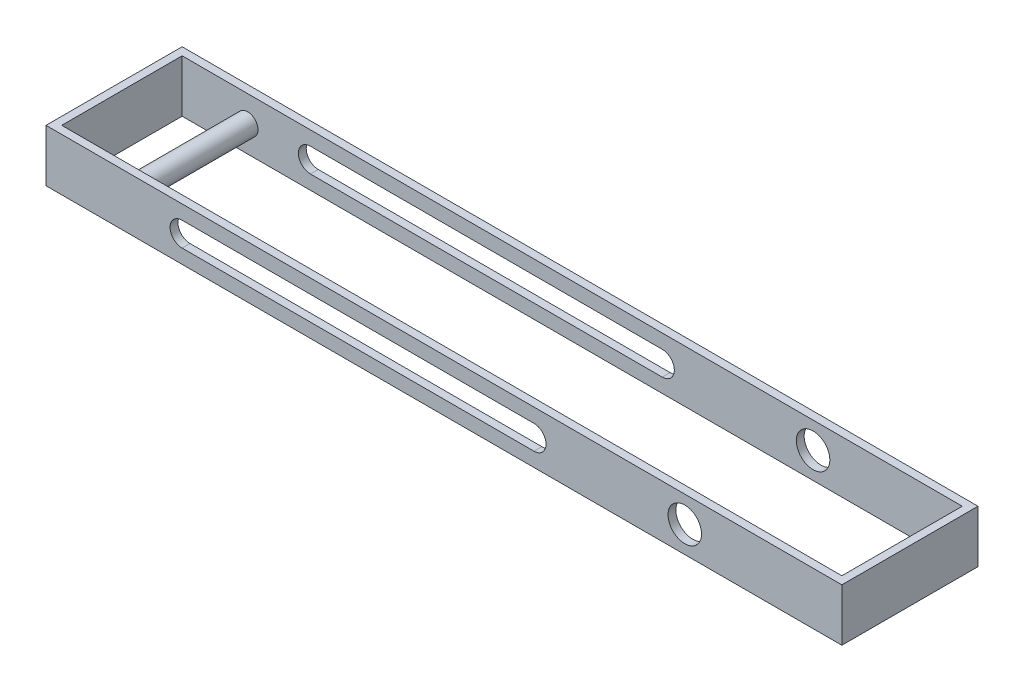
ISO-10303-21;
HEADER;
FILE_DESCRIPTION(('STEP AP214'),'2;1');
FILE_NAME('part.step','',(''),(''),'','','');
FILE_SCHEMA(('AUTOMOTIVE_DESIGN { 1 0 10303 214 1 1 1 1 }'));
ENDSEC;
DATA;
#1=APPLICATION_CONTEXT('core data for automotive mechanical design processes');
#2=APPLICATION_PROTOCOL_DEFINITION('international standard','automotive_design',2000,#1);
#3=PRODUCT_CONTEXT('',#1,'mechanical');
#4=PRODUCT('Part','Part','',(#3));
#5=PRODUCT_RELATED_PRODUCT_CATEGORY('part','',(#4));
#6=PRODUCT_DEFINITION_FORMATION('','',#4);
#7=PRODUCT_DEFINITION_CONTEXT('part definition',#1,'design');
#8=PRODUCT_DEFINITION('design','',#6,#7);
#9=PRODUCT_DEFINITION_SHAPE('','',#8);
#10=(LENGTH_UNIT() NAMED_UNIT(*) SI_UNIT(.MILLI.,.METRE.));
#11=(NAMED_UNIT(*) PLANE_ANGLE_UNIT() SI_UNIT($,.RADIAN.));
#12=(NAMED_UNIT(*) SI_UNIT($,.STERADIAN.) SOLID_ANGLE_UNIT());
#13=UNCERTAINTY_MEASURE_WITH_UNIT(LENGTH_MEASURE(1.E-05),#10,'distance_accuracy_value','');
#14=(GEOMETRIC_REPRESENTATION_CONTEXT(3) GLOBAL_UNCERTAINTY_ASSIGNED_CONTEXT((#13)) GLOBAL_UNIT_ASSIGNED_CONTEXT((#10,
#11,#12)) REPRESENTATION_CONTEXT('',''));
#15=CARTESIAN_POINT('',(0.,0.,0.));
#16=DIRECTION('',(0.,0.,1.));
#17=DIRECTION('',(1.,0.,0.));
#18=AXIS2_PLACEMENT_3D('',#15,#16,#17);
#19=CARTESIAN_POINT('',(0.,2.5,0.));
#20=DIRECTION('',(0.,-1.,0.));
#21=DIRECTION('',(0.,0.,-1.));
#22=AXIS2_PLACEMENT_3D('',#19,#20,#21);
#23=PLANE('',#22);
#24=DIRECTION('',(0.,0.,1.));
#25=VECTOR('',#24,1.);
#26=CARTESIAN_POINT('',(-38.,2.5,-6.5));
#27=LINE('',#26,#25);
#28=CARTESIAN_POINT('',(-38.,2.5,-6.5));
#29=VERTEX_POINT('',#28);
#30=CARTESIAN_POINT('',(-38.,2.5,6.5));
#31=VERTEX_POINT('',#30);
#32=EDGE_CURVE('E290',#29,#31,#27,.T.);
#33=ORIENTED_EDGE('',*,*,#32,.T.);
#34=DIRECTION('',(1.,0.,0.));
#35=VECTOR('',#34,1.);
#36=CARTESIAN_POINT('',(38.,2.5,6.49999999999999));
#37=LINE('',#36,#35);
#38=CARTESIAN_POINT('',(38.,2.5,6.49999999999999));
#39=VERTEX_POINT('',#38);
#40=EDGE_CURVE('E294',#31,#39,#37,.T.);
#41=ORIENTED_EDGE('',*,*,#40,.T.);
#42=DIRECTION('',(0.,0.,-1.));
#43=VECTOR('',#42,1.);
#44=CARTESIAN_POINT('',(38.,2.5,-6.50000000000001));
#45=LINE('',#44,#43);
#46=CARTESIAN_POINT('',(38.,2.5,-6.50000000000001));
#47=VERTEX_POINT('',#46);
#48=EDGE_CURVE('E298',#39,#47,#45,.T.);
#49=ORIENTED_EDGE('',*,*,#48,.T.);
#50=DIRECTION('',(-1.,0.,0.));
#51=VECTOR('',#50,1.);
#52=CARTESIAN_POINT('',(38.,2.5,-6.50000000000001));
#53=LINE('',#52,#51);
#54=EDGE_CURVE('E301',#47,#29,#53,.T.);
#55=ORIENTED_EDGE('',*,*,#54,.T.);
#56=EDGE_LOOP('',(#33,#41,#49,#55));
#57=FACE_BOUND('',#56,.T.);
#58=DIRECTION('',(0.,0.,1.));
#59=VECTOR('',#58,1.);
#60=CARTESIAN_POINT('',(-37.25,2.5,-5.74999999999999));
#61=LINE('',#60,#59);
#62=CARTESIAN_POINT('',(-37.25,2.5,-5.74999999999999));
#63=VERTEX_POINT('',#62);
#64=CARTESIAN_POINT('',(-37.25,2.5,5.75));
#65=VERTEX_POINT('',#64);
#66=EDGE_CURVE('E247',#63,#65,#61,.T.);
#67=ORIENTED_EDGE('',*,*,#66,.F.);
#68=DIRECTION('',(-1.,0.,0.));
#69=VECTOR('',#68,1.);
#70=CARTESIAN_POINT('',(37.25,2.5,-5.75));
#71=LINE('',#70,#69);
#72=CARTESIAN_POINT('',(37.25,2.5,-5.75));
#73=VERTEX_POINT('',#72);
#74=EDGE_CURVE('E258',#73,#63,#71,.T.);
#75=ORIENTED_EDGE('',*,*,#74,.F.);
#76=DIRECTION('',(0.,0.,-1.));
#77=VECTOR('',#76,1.);
#78=CARTESIAN_POINT('',(37.25,2.5,-5.75));
#79=LINE('',#78,#77);
#80=CARTESIAN_POINT('',(37.25,2.5,5.75));
#81=VERTEX_POINT('',#80);
#82=EDGE_CURVE('E254',#81,#73,#79,.T.);
#83=ORIENTED_EDGE('',*,*,#82,.F.);
#84=DIRECTION('',(1.,0.,0.));
#85=VECTOR('',#84,1.);
#86=CARTESIAN_POINT('',(37.25,2.5,5.75));
#87=LINE('',#86,#85);
#88=EDGE_CURVE('E250',#65,#81,#87,.T.);
#89=ORIENTED_EDGE('',*,*,#88,.F.);
#90=EDGE_LOOP('',(#67,#75,#83,#89));
#91=FACE_BOUND('',#90,.T.);
#92=ADVANCED_FACE('F51',(#57,#91),#23,.F.);
#93=CARTESIAN_POINT('',(0.,-2.5,0.));
#94=DIRECTION('',(0.,-1.,0.));
#95=DIRECTION('',(0.,0.,-1.));
#96=AXIS2_PLACEMENT_3D('',#93,#94,#95);
#97=PLANE('',#96);
#98=DIRECTION('',(0.,0.,1.));
#99=VECTOR('',#98,1.);
#100=CARTESIAN_POINT('',(-38.,-2.5,-6.5));
#101=LINE('',#100,#99);
#102=CARTESIAN_POINT('',(-38.,-2.5,-6.5));
#103=VERTEX_POINT('',#102);
#104=CARTESIAN_POINT('',(-38.,-2.5,6.5));
#105=VERTEX_POINT('',#104);
#106=EDGE_CURVE('E289',#103,#105,#101,.T.);
#107=ORIENTED_EDGE('',*,*,#106,.F.);
#108=DIRECTION('',(-1.,0.,0.));
#109=VECTOR('',#108,1.);
#110=CARTESIAN_POINT('',(38.,-2.5,-6.50000000000001));
#111=LINE('',#110,#109);
#112=CARTESIAN_POINT('',(38.,-2.5,-6.50000000000001));
#113=VERTEX_POINT('',#112);
#114=EDGE_CURVE('E295',#113,#103,#111,.T.);
#115=ORIENTED_EDGE('',*,*,#114,.F.);
#116=DIRECTION('',(0.,0.,-1.));
#117=VECTOR('',#116,1.);
#118=CARTESIAN_POINT('',(38.,-2.5,-6.50000000000001));
#119=LINE('',#118,#117);
#120=CARTESIAN_POINT('',(38.,-2.5,6.49999999999999));
#121=VERTEX_POINT('',#120);
#122=EDGE_CURVE('E311',#121,#113,#119,.T.);
#123=ORIENTED_EDGE('',*,*,#122,.F.);
#124=DIRECTION('',(1.,0.,0.));
#125=VECTOR('',#124,1.);
#126=CARTESIAN_POINT('',(38.,-2.5,6.49999999999999));
#127=LINE('',#126,#125);
#128=EDGE_CURVE('E308',#105,#121,#127,.T.);
#129=ORIENTED_EDGE('',*,*,#128,.F.);
#130=EDGE_LOOP('',(#107,#115,#123,#129));
#131=FACE_BOUND('',#130,.T.);
#132=DIRECTION('',(-1.,0.,0.));
#133=VECTOR('',#132,1.);
#134=CARTESIAN_POINT('',(37.25,-2.5,-5.75));
#135=LINE('',#134,#133);
#136=CARTESIAN_POINT('',(37.25,-2.5,-5.75));
#137=VERTEX_POINT('',#136);
#138=CARTESIAN_POINT('',(-37.25,-2.5,-5.74999999999999));
#139=VERTEX_POINT('',#138);
#140=EDGE_CURVE('E251',#137,#139,#135,.T.);
#141=ORIENTED_EDGE('',*,*,#140,.T.);
#142=DIRECTION('',(0.,0.,1.));
#143=VECTOR('',#142,1.);
#144=CARTESIAN_POINT('',(-37.25,-2.5,-5.74999999999999));
#145=LINE('',#144,#143);
#146=CARTESIAN_POINT('',(-37.25,-2.5,5.75));
#147=VERTEX_POINT('',#146);
#148=EDGE_CURVE('E246',#139,#147,#145,.T.);
#149=ORIENTED_EDGE('',*,*,#148,.T.);
#150=DIRECTION('',(1.,0.,0.));
#151=VECTOR('',#150,1.);
#152=CARTESIAN_POINT('',(37.25,-2.5,5.75));
#153=LINE('',#152,#151);
#154=CARTESIAN_POINT('',(37.25,-2.5,5.75));
#155=VERTEX_POINT('',#154);
#156=EDGE_CURVE('E265',#147,#155,#153,.T.);
#157=ORIENTED_EDGE('',*,*,#156,.T.);
#158=DIRECTION('',(0.,0.,-1.));
#159=VECTOR('',#158,1.);
#160=CARTESIAN_POINT('',(37.25,-2.5,-5.75));
#161=LINE('',#160,#159);
#162=EDGE_CURVE('E269',#155,#137,#161,.T.);
#163=ORIENTED_EDGE('',*,*,#162,.T.);
#164=EDGE_LOOP('',(#141,#149,#157,#163));
#165=FACE_BOUND('',#164,.T.);
#166=ADVANCED_FACE('F360',(#131,#165),#97,.T.);
#167=CARTESIAN_POINT('',(-38.,2.5,-6.5));
#168=DIRECTION('',(1.,0.,0.));
#169=DIRECTION('',(0.,0.,-1.));
#170=AXIS2_PLACEMENT_3D('',#167,#168,#169);
#171=PLANE('',#170);
#172=ORIENTED_EDGE('',*,*,#106,.T.);
#173=DIRECTION('',(0.,-1.,0.));
#174=VECTOR('',#173,1.);
#175=CARTESIAN_POINT('',(-38.,2.5,6.5));
#176=LINE('',#175,#174);
#177=EDGE_CURVE('E327',#31,#105,#176,.T.);
#178=ORIENTED_EDGE('',*,*,#177,.F.);
#179=ORIENTED_EDGE('',*,*,#32,.F.);
#180=DIRECTION('',(0.,-1.,0.));
#181=VECTOR('',#180,1.);
#182=CARTESIAN_POINT('',(-38.,2.5,-6.5));
#183=LINE('',#182,#181);
#184=EDGE_CURVE('E304',#29,#103,#183,.T.);
#185=ORIENTED_EDGE('',*,*,#184,.T.);
#186=EDGE_LOOP('',(#172,#178,#179,#185));
#187=FACE_BOUND('',#186,.T.);
#188=ADVANCED_FACE('F53',(#187),#171,.F.);
#189=CARTESIAN_POINT('',(38.,2.5,6.49999999999999));
#190=DIRECTION('',(0.,0.,-1.));
#191=DIRECTION('',(-1.,0.,0.));
#192=AXIS2_PLACEMENT_3D('',#189,#190,#191);
#193=PLANE('',#192);
#194=CARTESIAN_POINT('',(23.,0.,6.5));
#195=DIRECTION('',(0.,0.,1.));
#196=DIRECTION('',(1.,0.,0.));
#197=AXIS2_PLACEMENT_3D('',#194,#195,#196);
#198=CIRCLE('',#197,1.6);
#199=CARTESIAN_POINT('',(24.6,0.,6.5));
#200=VERTEX_POINT('',#199);
#201=EDGE_CURVE('E200',#200,#200,#198,.T.);
#202=ORIENTED_EDGE('',*,*,#201,.F.);
#203=EDGE_LOOP('',(#202));
#204=FACE_BOUND('',#203,.T.);
#205=DIRECTION('',(1.,0.,0.));
#206=VECTOR('',#205,1.);
#207=CARTESIAN_POINT('',(-25.,-1.15,6.5));
#208=LINE('',#207,#206);
#209=CARTESIAN_POINT('',(-25.,-1.15,6.5));
#210=VERTEX_POINT('',#209);
#211=CARTESIAN_POINT('',(8.6,-1.15,6.5));
#212=VERTEX_POINT('',#211);
#213=EDGE_CURVE('E209',#210,#212,#208,.T.);
#214=ORIENTED_EDGE('',*,*,#213,.F.);
#215=CARTESIAN_POINT('',(-25.,0.,6.5));
#216=DIRECTION('',(0.,0.,1.));
#217=DIRECTION('',(1.,0.,0.));
#218=AXIS2_PLACEMENT_3D('',#215,#216,#217);
#219=CIRCLE('',#218,1.15);
#220=CARTESIAN_POINT('',(-25.,1.15,6.5));
#221=VERTEX_POINT('',#220);
#222=EDGE_CURVE('E68',#221,#210,#219,.T.);
#223=ORIENTED_EDGE('',*,*,#222,.F.);
#224=DIRECTION('',(-1.,0.,0.));
#225=VECTOR('',#224,1.);
#226=CARTESIAN_POINT('',(-25.,1.15,6.5));
#227=LINE('',#226,#225);
#228=CARTESIAN_POINT('',(8.6,1.15,6.5));
#229=VERTEX_POINT('',#228);
#230=EDGE_CURVE('E193',#229,#221,#227,.T.);
#231=ORIENTED_EDGE('',*,*,#230,.F.);
#232=CARTESIAN_POINT('',(8.6,0.,6.5));
#233=DIRECTION('',(0.,0.,1.));
#234=DIRECTION('',(1.,0.,0.));
#235=AXIS2_PLACEMENT_3D('',#232,#233,#234);
#236=CIRCLE('',#235,1.15);
#237=EDGE_CURVE('E197',#212,#229,#236,.T.);
#238=ORIENTED_EDGE('',*,*,#237,.F.);
#239=EDGE_LOOP('',(#214,#223,#231,#238));
#240=FACE_BOUND('',#239,.T.);
#241=ORIENTED_EDGE('',*,*,#128,.T.);
#242=DIRECTION('',(0.,-1.,0.));
#243=VECTOR('',#242,1.);
#244=CARTESIAN_POINT('',(38.,2.5,6.49999999999999));
#245=LINE('',#244,#243);
#246=EDGE_CURVE('E323',#39,#121,#245,.T.);
#247=ORIENTED_EDGE('',*,*,#246,.F.);
#248=ORIENTED_EDGE('',*,*,#40,.F.);
#249=ORIENTED_EDGE('',*,*,#177,.T.);
#250=EDGE_LOOP('',(#241,#247,#248,#249));
#251=FACE_BOUND('',#250,.T.);
#252=ADVANCED_FACE('F378',(#204,#240,#251),#193,.F.);
#253=CARTESIAN_POINT('',(38.,2.5,-6.50000000000001));
#254=DIRECTION('',(-1.,0.,0.));
#255=DIRECTION('',(0.,0.,1.));
#256=AXIS2_PLACEMENT_3D('',#253,#254,#255);
#257=PLANE('',#256);
#258=ORIENTED_EDGE('',*,*,#122,.T.);
#259=DIRECTION('',(0.,-1.,0.));
#260=VECTOR('',#259,1.);
#261=CARTESIAN_POINT('',(38.,2.5,-6.50000000000001));
#262=LINE('',#261,#260);
#263=EDGE_CURVE('E319',#47,#113,#262,.T.);
#264=ORIENTED_EDGE('',*,*,#263,.F.);
#265=ORIENTED_EDGE('',*,*,#48,.F.);
#266=ORIENTED_EDGE('',*,*,#246,.T.);
#267=EDGE_LOOP('',(#258,#264,#265,#266));
#268=FACE_BOUND('',#267,.T.);
#269=ADVANCED_FACE('F375',(#268),#257,.F.);
#270=CARTESIAN_POINT('',(38.,2.5,-6.50000000000001));
#271=DIRECTION('',(0.,0.,1.));
#272=DIRECTION('',(1.,0.,0.));
#273=AXIS2_PLACEMENT_3D('',#270,#271,#272);
#274=PLANE('',#273);
#275=CARTESIAN_POINT('',(23.,0.,-6.50000000000001));
#276=DIRECTION('',(0.,0.,1.));
#277=DIRECTION('',(1.,0.,0.));
#278=AXIS2_PLACEMENT_3D('',#275,#276,#277);
#279=CIRCLE('',#278,1.6);
#280=CARTESIAN_POINT('',(24.6,0.,-6.50000000000001));
#281=VERTEX_POINT('',#280);
#282=EDGE_CURVE('E232',#281,#281,#279,.T.);
#283=ORIENTED_EDGE('',*,*,#282,.T.);
#284=EDGE_LOOP('',(#283));
#285=FACE_BOUND('',#284,.T.);
#286=DIRECTION('',(-1.,0.,0.));
#287=VECTOR('',#286,1.);
#288=CARTESIAN_POINT('',(-25.,1.15,-6.50000000000001));
#289=LINE('',#288,#287);
#290=CARTESIAN_POINT('',(8.6,1.15,-6.50000000000001));
#291=VERTEX_POINT('',#290);
#292=CARTESIAN_POINT('',(-25.,1.15,-6.50000000000001));
#293=VERTEX_POINT('',#292);
#294=EDGE_CURVE('E191',#291,#293,#289,.T.);
#295=ORIENTED_EDGE('',*,*,#294,.T.);
#296=CARTESIAN_POINT('',(-25.,0.,-6.50000000000001));
#297=DIRECTION('',(0.,0.,1.));
#298=DIRECTION('',(1.,0.,0.));
#299=AXIS2_PLACEMENT_3D('',#296,#297,#298);
#300=CIRCLE('',#299,1.15);
#301=CARTESIAN_POINT('',(-25.,-1.15,-6.50000000000001));
#302=VERTEX_POINT('',#301);
#303=EDGE_CURVE('E172',#293,#302,#300,.T.);
#304=ORIENTED_EDGE('',*,*,#303,.T.);
#305=DIRECTION('',(1.,0.,0.));
#306=VECTOR('',#305,1.);
#307=CARTESIAN_POINT('',(-25.,-1.15,-6.50000000000001));
#308=LINE('',#307,#306);
#309=CARTESIAN_POINT('',(8.6,-1.15,-6.5));
#310=VERTEX_POINT('',#309);
#311=EDGE_CURVE('E182',#302,#310,#308,.T.);
#312=ORIENTED_EDGE('',*,*,#311,.T.);
#313=CARTESIAN_POINT('',(8.6,0.,-6.50000000000001));
#314=DIRECTION('',(0.,0.,1.));
#315=DIRECTION('',(1.,0.,0.));
#316=AXIS2_PLACEMENT_3D('',#313,#314,#315);
#317=CIRCLE('',#316,1.15);
#318=EDGE_CURVE('E76',#310,#291,#317,.T.);
#319=ORIENTED_EDGE('',*,*,#318,.T.);
#320=EDGE_LOOP('',(#295,#304,#312,#319));
#321=FACE_BOUND('',#320,.T.);
#322=ORIENTED_EDGE('',*,*,#114,.T.);
#323=ORIENTED_EDGE('',*,*,#184,.F.);
#324=ORIENTED_EDGE('',*,*,#54,.F.);
#325=ORIENTED_EDGE('',*,*,#263,.T.);
#326=EDGE_LOOP('',(#322,#323,#324,#325));
#327=FACE_BOUND('',#326,.T.);
#328=ADVANCED_FACE('F188',(#285,#321,#327),#274,.F.);
#329=CARTESIAN_POINT('',(-37.25,2.5,-5.74999999999999));
#330=DIRECTION('',(1.,0.,0.));
#331=DIRECTION('',(0.,0.,-1.));
#332=AXIS2_PLACEMENT_3D('',#329,#330,#331);
#333=PLANE('',#332);
#334=ORIENTED_EDGE('',*,*,#148,.F.);
#335=DIRECTION('',(0.,-1.,0.));
#336=VECTOR('',#335,1.);
#337=CARTESIAN_POINT('',(-37.25,2.5,-5.74999999999999));
#338=LINE('',#337,#336);
#339=EDGE_CURVE('E261',#63,#139,#338,.T.);
#340=ORIENTED_EDGE('',*,*,#339,.F.);
#341=ORIENTED_EDGE('',*,*,#66,.T.);
#342=DIRECTION('',(0.,-1.,0.));
#343=VECTOR('',#342,1.);
#344=CARTESIAN_POINT('',(-37.25,2.5,5.75));
#345=LINE('',#344,#343);
#346=EDGE_CURVE('E285',#65,#147,#345,.T.);
#347=ORIENTED_EDGE('',*,*,#346,.T.);
#348=EDGE_LOOP('',(#334,#340,#341,#347));
#349=FACE_BOUND('',#348,.T.);
#350=ADVANCED_FACE('F370',(#349),#333,.T.);
#351=CARTESIAN_POINT('',(37.25,2.5,5.75));
#352=DIRECTION('',(0.,0.,-1.));
#353=DIRECTION('',(-1.,0.,0.));
#354=AXIS2_PLACEMENT_3D('',#351,#352,#353);
#355=PLANE('',#354);
#356=CARTESIAN_POINT('',(-31.,0.,5.75));
#357=DIRECTION('',(0.,0.,-1.));
#358=DIRECTION('',(-1.,0.,0.));
#359=AXIS2_PLACEMENT_3D('',#356,#357,#358);
#360=CIRCLE('',#359,0.999999999999998);
#361=CARTESIAN_POINT('',(-32.,0.,5.75));
#362=VERTEX_POINT('',#361);
#363=EDGE_CURVE('E210',#362,#362,#360,.T.);
#364=ORIENTED_EDGE('',*,*,#363,.F.);
#365=EDGE_LOOP('',(#364));
#366=FACE_BOUND('',#365,.T.);
#367=CARTESIAN_POINT('',(23.,0.,5.75));
#368=DIRECTION('',(0.,0.,-1.));
#369=DIRECTION('',(-1.,0.,0.));
#370=AXIS2_PLACEMENT_3D('',#367,#368,#369);
#371=CIRCLE('',#370,1.6);
#372=CARTESIAN_POINT('',(24.6,0.,5.75));
#373=VERTEX_POINT('',#372);
#374=EDGE_CURVE('E242',#373,#373,#371,.T.);
#375=ORIENTED_EDGE('',*,*,#374,.F.);
#376=EDGE_LOOP('',(#375));
#377=FACE_BOUND('',#376,.T.);
#378=CARTESIAN_POINT('',(-25.,0.,5.75));
#379=DIRECTION('',(0.,0.,-1.));
#380=DIRECTION('',(-1.,0.,0.));
#381=AXIS2_PLACEMENT_3D('',#378,#379,#380);
#382=CIRCLE('',#381,1.15);
#383=CARTESIAN_POINT('',(-25.,-1.15,5.75));
#384=VERTEX_POINT('',#383);
#385=CARTESIAN_POINT('',(-25.,1.15,5.75));
#386=VERTEX_POINT('',#385);
#387=EDGE_CURVE('E239',#384,#386,#382,.T.);
#388=ORIENTED_EDGE('',*,*,#387,.F.);
#389=DIRECTION('',(-1.,0.,0.));
#390=VECTOR('',#389,1.);
#391=CARTESIAN_POINT('',(37.25,-1.15,5.75));
#392=LINE('',#391,#390);
#393=CARTESIAN_POINT('',(8.6,-1.15,5.75));
#394=VERTEX_POINT('',#393);
#395=EDGE_CURVE('E228',#394,#384,#392,.T.);
#396=ORIENTED_EDGE('',*,*,#395,.F.);
#397=CARTESIAN_POINT('',(8.6,0.,5.75));
#398=DIRECTION('',(0.,0.,-1.));
#399=DIRECTION('',(-1.,0.,0.));
#400=AXIS2_PLACEMENT_3D('',#397,#398,#399);
#401=CIRCLE('',#400,1.15);
#402=CARTESIAN_POINT('',(8.6,1.15,5.74999999999999));
#403=VERTEX_POINT('',#402);
#404=EDGE_CURVE('E231',#403,#394,#401,.T.);
#405=ORIENTED_EDGE('',*,*,#404,.F.);
#406=DIRECTION('',(1.,0.,0.));
#407=VECTOR('',#406,1.);
#408=CARTESIAN_POINT('',(37.25,1.15,5.75));
#409=LINE('',#408,#407);
#410=EDGE_CURVE('E236',#386,#403,#409,.T.);
#411=ORIENTED_EDGE('',*,*,#410,.F.);
#412=EDGE_LOOP('',(#388,#396,#405,#411));
#413=FACE_BOUND('',#412,.T.);
#414=ORIENTED_EDGE('',*,*,#156,.F.);
#415=ORIENTED_EDGE('',*,*,#346,.F.);
#416=ORIENTED_EDGE('',*,*,#88,.T.);
#417=DIRECTION('',(0.,-1.,0.));
#418=VECTOR('',#417,1.);
#419=CARTESIAN_POINT('',(37.25,2.5,5.75));
#420=LINE('',#419,#418);
#421=EDGE_CURVE('E282',#81,#155,#420,.T.);
#422=ORIENTED_EDGE('',*,*,#421,.T.);
#423=EDGE_LOOP('',(#414,#415,#416,#422));
#424=FACE_BOUND('',#423,.T.);
#425=ADVANCED_FACE('F414',(#366,#377,#413,#424),#355,.T.);
#426=CARTESIAN_POINT('',(37.25,2.5,-5.75));
#427=DIRECTION('',(-1.,0.,0.));
#428=DIRECTION('',(0.,0.,1.));
#429=AXIS2_PLACEMENT_3D('',#426,#427,#428);
#430=PLANE('',#429);
#431=ORIENTED_EDGE('',*,*,#162,.F.);
#432=ORIENTED_EDGE('',*,*,#421,.F.);
#433=ORIENTED_EDGE('',*,*,#82,.T.);
#434=DIRECTION('',(0.,-1.,0.));
#435=VECTOR('',#434,1.);
#436=CARTESIAN_POINT('',(37.25,2.5,-5.75));
#437=LINE('',#436,#435);
#438=EDGE_CURVE('E279',#73,#137,#437,.T.);
#439=ORIENTED_EDGE('',*,*,#438,.T.);
#440=EDGE_LOOP('',(#431,#432,#433,#439));
#441=FACE_BOUND('',#440,.T.);
#442=ADVANCED_FACE('F416',(#441),#430,.T.);
#443=CARTESIAN_POINT('',(37.25,2.5,-5.75));
#444=DIRECTION('',(0.,0.,1.));
#445=DIRECTION('',(1.,0.,0.));
#446=AXIS2_PLACEMENT_3D('',#443,#444,#445);
#447=PLANE('',#446);
#448=CARTESIAN_POINT('',(-31.,0.,-5.75));
#449=DIRECTION('',(0.,0.,1.));
#450=DIRECTION('',(1.,0.,0.));
#451=AXIS2_PLACEMENT_3D('',#448,#449,#450);
#452=CIRCLE('',#451,0.999999999999998);
#453=CARTESIAN_POINT('',(-30.,0.,-5.75));
#454=VERTEX_POINT('',#453);
#455=EDGE_CURVE('E475',#454,#454,#452,.T.);
#456=ORIENTED_EDGE('',*,*,#455,.F.);
#457=EDGE_LOOP('',(#456));
#458=FACE_BOUND('',#457,.T.);
#459=CARTESIAN_POINT('',(23.,0.,-5.75));
#460=DIRECTION('',(0.,0.,1.));
#461=DIRECTION('',(1.,0.,0.));
#462=AXIS2_PLACEMENT_3D('',#459,#460,#461);
#463=CIRCLE('',#462,1.6);
#464=CARTESIAN_POINT('',(24.6,0.,-5.75));
#465=VERTEX_POINT('',#464);
#466=EDGE_CURVE('E55',#465,#465,#463,.T.);
#467=ORIENTED_EDGE('',*,*,#466,.F.);
#468=EDGE_LOOP('',(#467));
#469=FACE_BOUND('',#468,.T.);
#470=CARTESIAN_POINT('',(-25.,0.,-5.75));
#471=DIRECTION('',(0.,0.,1.));
#472=DIRECTION('',(1.,0.,0.));
#473=AXIS2_PLACEMENT_3D('',#470,#471,#472);
#474=CIRCLE('',#473,1.15);
#475=CARTESIAN_POINT('',(-25.,1.15,-5.75));
#476=VERTEX_POINT('',#475);
#477=CARTESIAN_POINT('',(-25.,-1.15,-5.75));
#478=VERTEX_POINT('',#477);
#479=EDGE_CURVE('E13',#476,#478,#474,.T.);
#480=ORIENTED_EDGE('',*,*,#479,.F.);
#481=DIRECTION('',(-1.,0.,0.));
#482=VECTOR('',#481,1.);
#483=CARTESIAN_POINT('',(37.25,1.15,-5.75));
#484=LINE('',#483,#482);
#485=CARTESIAN_POINT('',(8.6,1.15,-5.75));
#486=VERTEX_POINT('',#485);
#487=EDGE_CURVE('E61',#486,#476,#484,.T.);
#488=ORIENTED_EDGE('',*,*,#487,.F.);
#489=CARTESIAN_POINT('',(8.6,0.,-5.75));
#490=DIRECTION('',(0.,0.,1.));
#491=DIRECTION('',(1.,0.,0.));
#492=AXIS2_PLACEMENT_3D('',#489,#490,#491);
#493=CIRCLE('',#492,1.15);
#494=CARTESIAN_POINT('',(8.6,-1.15,-5.75));
#495=VERTEX_POINT('',#494);
#496=EDGE_CURVE('E334',#495,#486,#493,.T.);
#497=ORIENTED_EDGE('',*,*,#496,.F.);
#498=DIRECTION('',(1.,0.,0.));
#499=VECTOR('',#498,1.);
#500=CARTESIAN_POINT('',(37.25,-1.15,-5.75));
#501=LINE('',#500,#499);
#502=EDGE_CURVE('E331',#478,#495,#501,.T.);
#503=ORIENTED_EDGE('',*,*,#502,.F.);
#504=EDGE_LOOP('',(#480,#488,#497,#503));
#505=FACE_BOUND('',#504,.T.);
#506=ORIENTED_EDGE('',*,*,#140,.F.);
#507=ORIENTED_EDGE('',*,*,#438,.F.);
#508=ORIENTED_EDGE('',*,*,#74,.T.);
#509=ORIENTED_EDGE('',*,*,#339,.T.);
#510=EDGE_LOOP('',(#506,#507,#508,#509));
#511=FACE_BOUND('',#510,.T.);
#512=ADVANCED_FACE('F343',(#458,#469,#505,#511),#447,.T.);
#513=CARTESIAN_POINT('',(-25.,-1.15,-6.50000000000001));
#514=DIRECTION('',(0.,-1.,0.));
#515=DIRECTION('',(0.,0.,-1.));
#516=AXIS2_PLACEMENT_3D('',#513,#514,#515);
#517=PLANE('',#516);
#518=ORIENTED_EDGE('',*,*,#502,.T.);
#519=DIRECTION('',(0.,0.,1.));
#520=VECTOR('',#519,1.);
#521=CARTESIAN_POINT('',(8.6,-1.15,-6.50000000000001));
#522=LINE('',#521,#520);
#523=EDGE_CURVE('E184',#310,#495,#522,.T.);
#524=ORIENTED_EDGE('',*,*,#523,.F.);
#525=ORIENTED_EDGE('',*,*,#311,.F.);
#526=DIRECTION('',(0.,0.,1.));
#527=VECTOR('',#526,1.);
#528=CARTESIAN_POINT('',(-25.,-1.15,-6.50000000000001));
#529=LINE('',#528,#527);
#530=EDGE_CURVE('E167',#302,#478,#529,.T.);
#531=ORIENTED_EDGE('',*,*,#530,.T.);
#532=EDGE_LOOP('',(#518,#524,#525,#531));
#533=FACE_BOUND('',#532,.T.);
#534=ADVANCED_FACE('F183',(#533),#517,.F.);
#535=CARTESIAN_POINT('',(8.6,0.,-6.50000000000001));
#536=DIRECTION('',(0.,0.,1.));
#537=DIRECTION('',(1.,0.,0.));
#538=AXIS2_PLACEMENT_3D('',#535,#536,#537);
#539=CYLINDRICAL_SURFACE('',#538,1.15);
#540=ORIENTED_EDGE('',*,*,#496,.T.);
#541=DIRECTION('',(0.,0.,1.));
#542=VECTOR('',#541,1.);
#543=CARTESIAN_POINT('',(8.6,1.15,-6.50000000000001));
#544=LINE('',#543,#542);
#545=EDGE_CURVE('E221',#291,#486,#544,.T.);
#546=ORIENTED_EDGE('',*,*,#545,.F.);
#547=ORIENTED_EDGE('',*,*,#318,.F.);
#548=ORIENTED_EDGE('',*,*,#523,.T.);
#549=EDGE_LOOP('',(#540,#546,#547,#548));
#550=FACE_BOUND('',#549,.T.);
#551=ADVANCED_FACE('F345',(#550),#539,.F.);
#552=CARTESIAN_POINT('',(-25.,1.15,-6.50000000000001));
#553=DIRECTION('',(0.,1.,0.));
#554=DIRECTION('',(0.,0.,1.));
#555=AXIS2_PLACEMENT_3D('',#552,#553,#554);
#556=PLANE('',#555);
#557=ORIENTED_EDGE('',*,*,#487,.T.);
#558=DIRECTION('',(0.,0.,1.));
#559=VECTOR('',#558,1.);
#560=CARTESIAN_POINT('',(-25.,1.15,-6.50000000000001));
#561=LINE('',#560,#559);
#562=EDGE_CURVE('E217',#293,#476,#561,.T.);
#563=ORIENTED_EDGE('',*,*,#562,.F.);
#564=ORIENTED_EDGE('',*,*,#294,.F.);
#565=ORIENTED_EDGE('',*,*,#545,.T.);
#566=EDGE_LOOP('',(#557,#563,#564,#565));
#567=FACE_BOUND('',#566,.T.);
#568=ADVANCED_FACE('F340',(#567),#556,.F.);
#569=CARTESIAN_POINT('',(-25.,0.,-6.50000000000001));
#570=DIRECTION('',(0.,0.,1.));
#571=DIRECTION('',(1.,0.,0.));
#572=AXIS2_PLACEMENT_3D('',#569,#570,#571);
#573=CYLINDRICAL_SURFACE('',#572,1.15);
#574=ORIENTED_EDGE('',*,*,#479,.T.);
#575=ORIENTED_EDGE('',*,*,#530,.F.);
#576=ORIENTED_EDGE('',*,*,#303,.F.);
#577=ORIENTED_EDGE('',*,*,#562,.T.);
#578=EDGE_LOOP('',(#574,#575,#576,#577));
#579=FACE_BOUND('',#578,.T.);
#580=ADVANCED_FACE('F169',(#579),#573,.F.);
#581=CARTESIAN_POINT('',(23.,0.,-6.50000000000001));
#582=DIRECTION('',(0.,0.,1.));
#583=DIRECTION('',(1.,0.,0.));
#584=AXIS2_PLACEMENT_3D('',#581,#582,#583);
#585=CYLINDRICAL_SURFACE('',#584,1.6);
#586=CARTESIAN_POINT('',(24.6,0.,-5.75));
#587=CARTESIAN_POINT('',(24.6,0.,-5.7578125));
#588=CARTESIAN_POINT('',(24.6,0.,-5.765625));
#589=CARTESIAN_POINT('',(24.6,0.,-5.78125));
#590=CARTESIAN_POINT('',(24.6,0.,-5.7890625));
#591=CARTESIAN_POINT('',(24.6,0.,-5.8046875));
#592=CARTESIAN_POINT('',(24.6,0.,-5.8125));
#593=CARTESIAN_POINT('',(24.6,0.,-5.828125));
#594=CARTESIAN_POINT('',(24.6,0.,-5.8359375));
#595=CARTESIAN_POINT('',(24.6,0.,-5.8515625));
#596=CARTESIAN_POINT('',(24.6,0.,-5.859375));
#597=CARTESIAN_POINT('',(24.6,0.,-5.875));
#598=CARTESIAN_POINT('',(24.6,0.,-5.8828125));
#599=CARTESIAN_POINT('',(24.6,0.,-5.8984375));
#600=CARTESIAN_POINT('',(24.6,0.,-5.90625));
#601=CARTESIAN_POINT('',(24.6,0.,-5.921875));
#602=CARTESIAN_POINT('',(24.6,0.,-5.9296875));
#603=CARTESIAN_POINT('',(24.6,0.,-5.9453125));
#604=CARTESIAN_POINT('',(24.6,0.,-5.953125));
#605=CARTESIAN_POINT('',(24.6,0.,-5.96875));
#606=CARTESIAN_POINT('',(24.6,0.,-5.9765625));
#607=CARTESIAN_POINT('',(24.6,0.,-5.9921875));
#608=CARTESIAN_POINT('',(24.6,0.,-6.));
#609=CARTESIAN_POINT('',(24.6,0.,-6.015625));
#610=CARTESIAN_POINT('',(24.6,0.,-6.0234375));
#611=CARTESIAN_POINT('',(24.6,0.,-6.0390625));
#612=CARTESIAN_POINT('',(24.6,0.,-6.046875));
#613=CARTESIAN_POINT('',(24.6,0.,-6.0625));
#614=CARTESIAN_POINT('',(24.6,0.,-6.0703125));
#615=CARTESIAN_POINT('',(24.6,0.,-6.0859375));
#616=CARTESIAN_POINT('',(24.6,0.,-6.09375));
#617=CARTESIAN_POINT('',(24.6,0.,-6.109375));
#618=CARTESIAN_POINT('',(24.6,0.,-6.1171875));
#619=CARTESIAN_POINT('',(24.6,0.,-6.1328125));
#620=CARTESIAN_POINT('',(24.6,0.,-6.140625));
#621=CARTESIAN_POINT('',(24.6,0.,-6.15625));
#622=CARTESIAN_POINT('',(24.6,0.,-6.1640625));
#623=CARTESIAN_POINT('',(24.6,0.,-6.1796875));
#624=CARTESIAN_POINT('',(24.6,0.,-6.1875));
#625=CARTESIAN_POINT('',(24.6,0.,-6.203125));
#626=CARTESIAN_POINT('',(24.6,0.,-6.2109375));
#627=CARTESIAN_POINT('',(24.6,0.,-6.2265625));
#628=CARTESIAN_POINT('',(24.6,0.,-6.234375));
#629=CARTESIAN_POINT('',(24.6,0.,-6.25));
#630=CARTESIAN_POINT('',(24.6,0.,-6.2578125));
#631=CARTESIAN_POINT('',(24.6,0.,-6.2734375));
#632=CARTESIAN_POINT('',(24.6,0.,-6.28125));
#633=CARTESIAN_POINT('',(24.6,0.,-6.296875));
#634=CARTESIAN_POINT('',(24.6,0.,-6.30468750000001));
#635=CARTESIAN_POINT('',(24.6,0.,-6.32031250000001));
#636=CARTESIAN_POINT('',(24.6,0.,-6.32812500000001));
#637=CARTESIAN_POINT('',(24.6,0.,-6.34375000000001));
#638=CARTESIAN_POINT('',(24.6,0.,-6.35156250000001));
#639=CARTESIAN_POINT('',(24.6,0.,-6.36718750000001));
#640=CARTESIAN_POINT('',(24.6,0.,-6.37500000000001));
#641=CARTESIAN_POINT('',(24.6,0.,-6.39062500000001));
#642=CARTESIAN_POINT('',(24.6,0.,-6.39843750000001));
#643=CARTESIAN_POINT('',(24.6,0.,-6.41406250000001));
#644=CARTESIAN_POINT('',(24.6,0.,-6.42187500000001));
#645=CARTESIAN_POINT('',(24.6,0.,-6.43750000000001));
#646=CARTESIAN_POINT('',(24.6,0.,-6.44531250000001));
#647=CARTESIAN_POINT('',(24.6,0.,-6.46093750000001));
#648=CARTESIAN_POINT('',(24.6,0.,-6.46875000000001));
#649=CARTESIAN_POINT('',(24.6,0.,-6.48437500000001));
#650=CARTESIAN_POINT('',(24.6,0.,-6.49218750000001));
#651=CARTESIAN_POINT('',(24.6,0.,-6.50000000000001));
#652=B_SPLINE_CURVE_WITH_KNOTS('',3,(#586,#587,#588,#589,#590,#591,#592,#593,#594,#595,#596,
#597,#598,#599,#600,#601,#602,#603,#604,#605,#606,#607,#608,#609,#610,#611,#612,#613,#614,#615,
#616,#617,#618,#619,#620,#621,#622,#623,#624,#625,#626,#627,#628,#629,#630,#631,#632,#633,#634,
#635,#636,#637,#638,#639,#640,#641,#642,#643,#644,#645,#646,#647,#648,#649,#650,#651),
.UNSPECIFIED.,.F.,.F.,(4,2,2,2,2,2,2,2,2,2,2,2,2,2,2,2,2,2,2,2,2,2,2,2,2,2,2,2,2,2,2,2,4),(0.,
0.0234375,0.046875,0.0703125000000001,0.0937500000000001,0.1171875,0.140625,0.1640625,
0.187500000000001,0.210937500000001,0.234375000000001,0.257812500000001,0.281250000000001,
0.304687500000001,0.328125000000001,0.351562500000001,0.375000000000002,0.398437500000002,
0.421875000000002,0.445312500000002,0.468750000000002,0.492187500000002,0.515625000000002,
0.539062500000002,0.562500000000003,0.585937500000003,0.609375000000003,0.632812500000003,
0.656250000000003,0.679687500000003,0.703125000000003,0.726562500000003,0.750000000000003),.UNSPECIFIED.);
#653=EDGE_CURVE('BSEAM428',#465,#281,#652,.T.);
#654=ORIENTED_EDGE('',*,*,#466,.T.);
#655=ORIENTED_EDGE('',*,*,#282,.F.);
#656=ORIENTED_EDGE('',*,*,#653,.T.);
#657=ORIENTED_EDGE('',*,*,#653,.F.);
#658=EDGE_LOOP('',(#654,#656,#655,#657));
#659=FACE_BOUND('',#658,.T.);
#660=ADVANCED_FACE('F428',(#659),#585,.F.);
#661=ORIENTED_EDGE('',*,*,#387,.T.);
#662=EDGE_CURVE('E220',#386,#221,#561,.T.);
#663=ORIENTED_EDGE('',*,*,#662,.T.);
#664=ORIENTED_EDGE('',*,*,#222,.T.);
#665=EDGE_CURVE('E179',#384,#210,#529,.T.);
#666=ORIENTED_EDGE('',*,*,#665,.F.);
#667=EDGE_LOOP('',(#661,#663,#664,#666));
#668=FACE_BOUND('',#667,.T.);
#669=ADVANCED_FACE('F429',(#668),#573,.F.);
#670=ORIENTED_EDGE('',*,*,#410,.T.);
#671=EDGE_CURVE('E225',#403,#229,#544,.T.);
#672=ORIENTED_EDGE('',*,*,#671,.T.);
#673=ORIENTED_EDGE('',*,*,#230,.T.);
#674=ORIENTED_EDGE('',*,*,#662,.F.);
#675=EDGE_LOOP('',(#670,#672,#673,#674));
#676=FACE_BOUND('',#675,.T.);
#677=ADVANCED_FACE('F354',(#676),#556,.F.);
#678=ORIENTED_EDGE('',*,*,#404,.T.);
#679=EDGE_CURVE('E178',#394,#212,#522,.T.);
#680=ORIENTED_EDGE('',*,*,#679,.T.);
#681=ORIENTED_EDGE('',*,*,#237,.T.);
#682=ORIENTED_EDGE('',*,*,#671,.F.);
#683=EDGE_LOOP('',(#678,#680,#681,#682));
#684=FACE_BOUND('',#683,.T.);
#685=ADVANCED_FACE('F348',(#684),#539,.F.);
#686=ORIENTED_EDGE('',*,*,#395,.T.);
#687=ORIENTED_EDGE('',*,*,#665,.T.);
#688=ORIENTED_EDGE('',*,*,#213,.T.);
#689=ORIENTED_EDGE('',*,*,#679,.F.);
#690=EDGE_LOOP('',(#686,#687,#688,#689));
#691=FACE_BOUND('',#690,.T.);
#692=ADVANCED_FACE('F356',(#691),#517,.F.);
#693=CARTESIAN_POINT('',(24.6,0.,5.75));
#694=CARTESIAN_POINT('',(24.6,0.,5.7578125));
#695=CARTESIAN_POINT('',(24.6,0.,5.765625));
#696=CARTESIAN_POINT('',(24.6,0.,5.78125));
#697=CARTESIAN_POINT('',(24.6,0.,5.7890625));
#698=CARTESIAN_POINT('',(24.6,0.,5.8046875));
#699=CARTESIAN_POINT('',(24.6,0.,5.8125));
#700=CARTESIAN_POINT('',(24.6,0.,5.828125));
#701=CARTESIAN_POINT('',(24.6,0.,5.8359375));
#702=CARTESIAN_POINT('',(24.6,0.,5.8515625));
#703=CARTESIAN_POINT('',(24.6,0.,5.859375));
#704=CARTESIAN_POINT('',(24.6,0.,5.875));
#705=CARTESIAN_POINT('',(24.6,0.,5.8828125));
#706=CARTESIAN_POINT('',(24.6,0.,5.8984375));
#707=CARTESIAN_POINT('',(24.6,0.,5.90625));
#708=CARTESIAN_POINT('',(24.6,0.,5.921875));
#709=CARTESIAN_POINT('',(24.6,0.,5.9296875));
#710=CARTESIAN_POINT('',(24.6,0.,5.9453125));
#711=CARTESIAN_POINT('',(24.6,0.,5.953125));
#712=CARTESIAN_POINT('',(24.6,0.,5.96875));
#713=CARTESIAN_POINT('',(24.6,0.,5.9765625));
#714=CARTESIAN_POINT('',(24.6,0.,5.9921875));
#715=CARTESIAN_POINT('',(24.6,0.,6.));
#716=CARTESIAN_POINT('',(24.6,0.,6.015625));
#717=CARTESIAN_POINT('',(24.6,0.,6.0234375));
#718=CARTESIAN_POINT('',(24.6,0.,6.0390625));
#719=CARTESIAN_POINT('',(24.6,0.,6.046875));
#720=CARTESIAN_POINT('',(24.6,0.,6.0625));
#721=CARTESIAN_POINT('',(24.6,0.,6.0703125));
#722=CARTESIAN_POINT('',(24.6,0.,6.0859375));
#723=CARTESIAN_POINT('',(24.6,0.,6.09375));
#724=CARTESIAN_POINT('',(24.6,0.,6.109375));
#725=CARTESIAN_POINT('',(24.6,0.,6.1171875));
#726=CARTESIAN_POINT('',(24.6,0.,6.1328125));
#727=CARTESIAN_POINT('',(24.6,0.,6.140625));
#728=CARTESIAN_POINT('',(24.6,0.,6.15625));
#729=CARTESIAN_POINT('',(24.6,0.,6.1640625));
#730=CARTESIAN_POINT('',(24.6,0.,6.1796875));
#731=CARTESIAN_POINT('',(24.6,0.,6.1875));
#732=CARTESIAN_POINT('',(24.6,0.,6.203125));
#733=CARTESIAN_POINT('',(24.6,0.,6.2109375));
#734=CARTESIAN_POINT('',(24.6,0.,6.2265625));
#735=CARTESIAN_POINT('',(24.6,0.,6.234375));
#736=CARTESIAN_POINT('',(24.6,0.,6.25));
#737=CARTESIAN_POINT('',(24.6,0.,6.2578125));
#738=CARTESIAN_POINT('',(24.6,0.,6.2734375));
#739=CARTESIAN_POINT('',(24.6,0.,6.28125));
#740=CARTESIAN_POINT('',(24.6,0.,6.296875));
#741=CARTESIAN_POINT('',(24.6,0.,6.3046875));
#742=CARTESIAN_POINT('',(24.6,0.,6.3203125));
#743=CARTESIAN_POINT('',(24.6,0.,6.328125));
#744=CARTESIAN_POINT('',(24.6,0.,6.34375));
#745=CARTESIAN_POINT('',(24.6,0.,6.3515625));
#746=CARTESIAN_POINT('',(24.6,0.,6.3671875));
#747=CARTESIAN_POINT('',(24.6,0.,6.375));
#748=CARTESIAN_POINT('',(24.6,0.,6.390625));
#749=CARTESIAN_POINT('',(24.6,0.,6.3984375));
#750=CARTESIAN_POINT('',(24.6,0.,6.4140625));
#751=CARTESIAN_POINT('',(24.6,0.,6.421875));
#752=CARTESIAN_POINT('',(24.6,0.,6.4375));
#753=CARTESIAN_POINT('',(24.6,0.,6.4453125));
#754=CARTESIAN_POINT('',(24.6,0.,6.4609375));
#755=CARTESIAN_POINT('',(24.6,0.,6.46875));
#756=CARTESIAN_POINT('',(24.6,0.,6.484375));
#757=CARTESIAN_POINT('',(24.6,0.,6.4921875));
#758=CARTESIAN_POINT('',(24.6,0.,6.5));
#759=B_SPLINE_CURVE_WITH_KNOTS('',3,(#693,#694,#695,#696,#697,#698,#699,#700,#701,#702,#703,
#704,#705,#706,#707,#708,#709,#710,#711,#712,#713,#714,#715,#716,#717,#718,#719,#720,#721,#722,
#723,#724,#725,#726,#727,#728,#729,#730,#731,#732,#733,#734,#735,#736,#737,#738,#739,#740,#741,
#742,#743,#744,#745,#746,#747,#748,#749,#750,#751,#752,#753,#754,#755,#756,#757,#758),
.UNSPECIFIED.,.F.,.F.,(4,2,2,2,2,2,2,2,2,2,2,2,2,2,2,2,2,2,2,2,2,2,2,2,2,2,2,2,2,2,2,2,4),(0.,
0.0234375000000009,0.046875,0.0703124999999992,0.0937500000000001,0.117187500000001,0.140625,
0.164062499999999,0.1875,0.210937500000001,0.234375,0.257812499999999,0.28125,0.304687500000001,
0.328125,0.351562499999999,0.375,0.398437500000001,0.421875,0.4453125,0.46875,0.492187500000001,
0.515625,0.5390625,0.5625,0.585937500000001,0.609375000000001,0.6328125,0.656250000000001,
0.679687500000001,0.703125000000001,0.7265625,0.750000000000001),.UNSPECIFIED.);
#760=EDGE_CURVE('BSEAM435',#373,#200,#759,.T.);
#761=ORIENTED_EDGE('',*,*,#374,.T.);
#762=ORIENTED_EDGE('',*,*,#201,.T.);
#763=ORIENTED_EDGE('',*,*,#760,.T.);
#764=ORIENTED_EDGE('',*,*,#760,.F.);
#765=EDGE_LOOP('',(#761,#763,#762,#764));
#766=FACE_BOUND('',#765,.T.);
#767=ADVANCED_FACE('F435',(#766),#585,.F.);
#768=CARTESIAN_POINT('',(-31.,0.,6.50199999999999));
#769=DIRECTION('',(0.,0.,-1.));
#770=DIRECTION('',(-1.,0.,0.));
#771=AXIS2_PLACEMENT_3D('',#768,#769,#770);
#772=CYLINDRICAL_SURFACE('',#771,0.999999999999998);
#773=ORIENTED_EDGE('',*,*,#363,.T.);
#774=EDGE_LOOP('',(#773));
#775=FACE_BOUND('',#774,.T.);
#776=ORIENTED_EDGE('',*,*,#455,.T.);
#777=EDGE_LOOP('',(#776));
#778=FACE_BOUND('',#777,.T.);
#779=ADVANCED_FACE('F458',(#775,#778),#772,.T.);
#780=CLOSED_SHELL('',(#92,#166,#188,#252,#269,#328,#350,#425,#442,#512,#534,#551,#568,#580,#660,
#669,#677,#685,#692,#767,#779));
#781=MANIFOLD_SOLID_BREP('B2',#780);
#782=ADVANCED_BREP_SHAPE_REPRESENTATION('',(#18,#781),#14);
#783=SHAPE_DEFINITION_REPRESENTATION(#9,#782);
ENDSEC;
END-ISO-10303-21;
